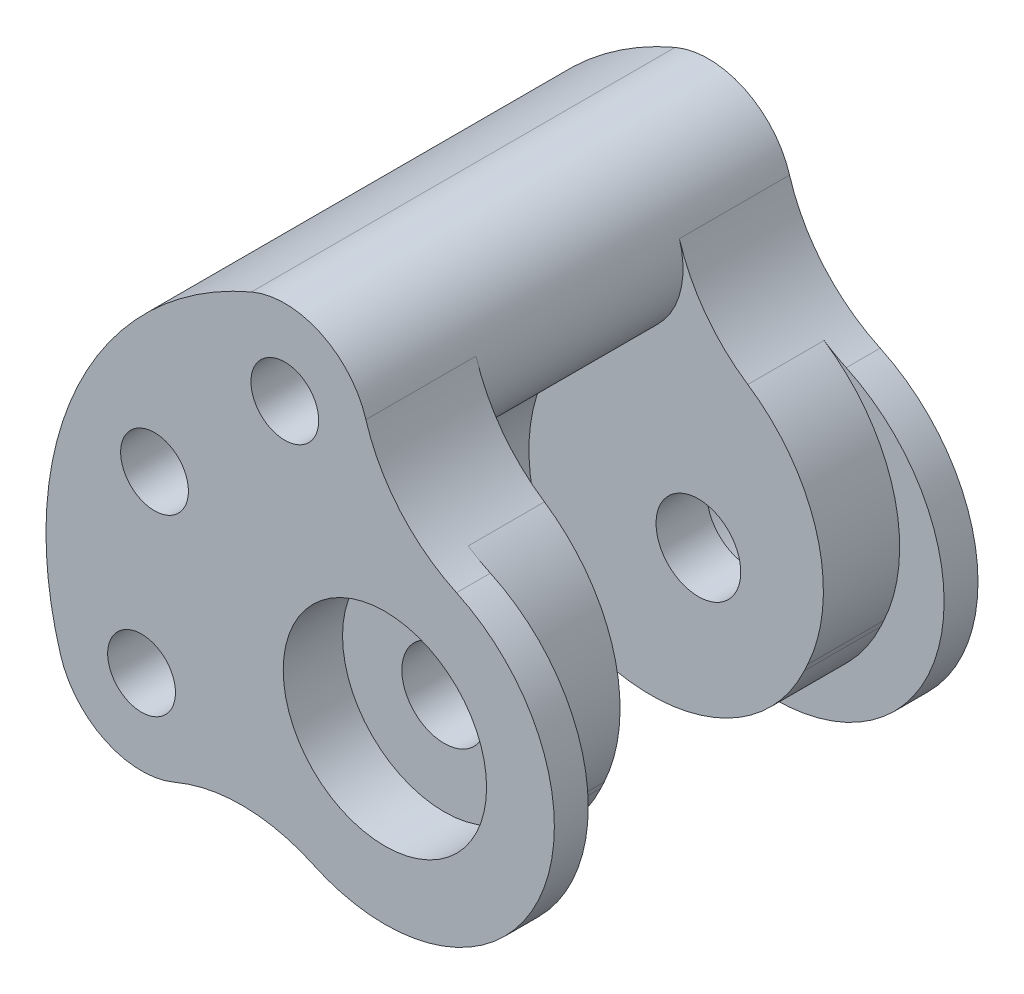
ISO-10303-21;
HEADER;
FILE_DESCRIPTION(('STEP AP214'),'2;1');
FILE_NAME('part.step','',(''),(''),'','','');
FILE_SCHEMA(('AUTOMOTIVE_DESIGN { 1 0 10303 214 1 1 1 1 }'));
ENDSEC;
DATA;
#1=APPLICATION_CONTEXT('core data for automotive mechanical design processes');
#2=APPLICATION_PROTOCOL_DEFINITION('international standard','automotive_design',2000,#1);
#3=PRODUCT_CONTEXT('',#1,'mechanical');
#4=PRODUCT('Part','Part','',(#3));
#5=PRODUCT_RELATED_PRODUCT_CATEGORY('part','',(#4));
#6=PRODUCT_DEFINITION_FORMATION('','',#4);
#7=PRODUCT_DEFINITION_CONTEXT('part definition',#1,'design');
#8=PRODUCT_DEFINITION('design','',#6,#7);
#9=PRODUCT_DEFINITION_SHAPE('','',#8);
#10=(LENGTH_UNIT() NAMED_UNIT(*) SI_UNIT(.MILLI.,.METRE.));
#11=(NAMED_UNIT(*) PLANE_ANGLE_UNIT() SI_UNIT($,.RADIAN.));
#12=(NAMED_UNIT(*) SI_UNIT($,.STERADIAN.) SOLID_ANGLE_UNIT());
#13=UNCERTAINTY_MEASURE_WITH_UNIT(LENGTH_MEASURE(1.E-05),#10,'distance_accuracy_value','');
#14=(GEOMETRIC_REPRESENTATION_CONTEXT(3) GLOBAL_UNCERTAINTY_ASSIGNED_CONTEXT((#13)) GLOBAL_UNIT_ASSIGNED_CONTEXT((#10,
#11,#12)) REPRESENTATION_CONTEXT('',''));
#15=CARTESIAN_POINT('',(0.,0.,0.));
#16=DIRECTION('',(0.,0.,1.));
#17=DIRECTION('',(1.,0.,0.));
#18=AXIS2_PLACEMENT_3D('',#15,#16,#17);
#19=CARTESIAN_POINT('',(0.,0.,25.));
#20=DIRECTION('',(0.,0.,-1.));
#21=DIRECTION('',(-1.,0.,0.));
#22=AXIS2_PLACEMENT_3D('',#19,#20,#21);
#23=CYLINDRICAL_SURFACE('',#22,2.5);
#24=CARTESIAN_POINT('',(0.,0.,18.5));
#25=DIRECTION('',(0.,0.,-1.));
#26=DIRECTION('',(-1.,0.,0.));
#27=AXIS2_PLACEMENT_3D('',#24,#25,#26);
#28=CIRCLE('',#27,2.5);
#29=CARTESIAN_POINT('',(-2.5,0.,18.5));
#30=VERTEX_POINT('',#29);
#31=EDGE_CURVE('E197',#30,#30,#28,.T.);
#32=ORIENTED_EDGE('',*,*,#31,.T.);
#33=EDGE_LOOP('',(#32));
#34=FACE_BOUND('',#33,.T.);
#35=CARTESIAN_POINT('',(0.,0.,21.5));
#36=DIRECTION('',(0.,0.,1.));
#37=DIRECTION('',(1.,0.,0.));
#38=AXIS2_PLACEMENT_3D('',#35,#36,#37);
#39=CIRCLE('',#38,2.5);
#40=CARTESIAN_POINT('',(2.5,0.,21.5));
#41=VERTEX_POINT('',#40);
#42=EDGE_CURVE('E299',#41,#41,#39,.T.);
#43=ORIENTED_EDGE('',*,*,#42,.T.);
#44=EDGE_LOOP('',(#43));
#45=FACE_BOUND('',#44,.T.);
#46=ADVANCED_FACE('F38',(#34,#45),#23,.F.);
#47=CARTESIAN_POINT('',(0.,0.,6.5));
#48=DIRECTION('',(0.,0.,-1.));
#49=DIRECTION('',(-1.,0.,0.));
#50=AXIS2_PLACEMENT_3D('',#47,#48,#49);
#51=CIRCLE('',#50,2.5);
#52=CARTESIAN_POINT('',(-2.5,0.,6.5));
#53=VERTEX_POINT('',#52);
#54=EDGE_CURVE('E205',#53,#53,#51,.T.);
#55=ORIENTED_EDGE('',*,*,#54,.F.);
#56=EDGE_LOOP('',(#55));
#57=FACE_BOUND('',#56,.T.);
#58=CARTESIAN_POINT('',(0.,0.,3.5));
#59=DIRECTION('',(0.,0.,-1.));
#60=DIRECTION('',(-1.,0.,0.));
#61=AXIS2_PLACEMENT_3D('',#58,#59,#60);
#62=CIRCLE('',#61,2.5);
#63=CARTESIAN_POINT('',(-2.5,0.,3.5));
#64=VERTEX_POINT('',#63);
#65=EDGE_CURVE('E203',#64,#64,#62,.T.);
#66=ORIENTED_EDGE('',*,*,#65,.T.);
#67=EDGE_LOOP('',(#66));
#68=FACE_BOUND('',#67,.T.);
#69=ADVANCED_FACE('F470',(#57,#68),#23,.F.);
#70=CARTESIAN_POINT('',(0.,0.,25.));
#71=DIRECTION('',(0.,0.,-1.));
#72=DIRECTION('',(-1.,0.,0.));
#73=AXIS2_PLACEMENT_3D('',#70,#71,#72);
#74=CYLINDRICAL_SURFACE('',#73,10.);
#75=DIRECTION('',(0.,0.,-1.));
#76=VECTOR('',#75,1.);
#77=CARTESIAN_POINT('',(-4.22618261740694,-9.06307787036653,25.));
#78=LINE('',#77,#76);
#79=CARTESIAN_POINT('',(-4.22618261740694,-9.06307787036653,25.));
#80=VERTEX_POINT('',#79);
#81=CARTESIAN_POINT('',(-4.22618261740694,-9.06307787036653,23.));
#82=VERTEX_POINT('',#81);
#83=EDGE_CURVE('E187',#80,#82,#78,.T.);
#84=ORIENTED_EDGE('',*,*,#83,.T.);
#85=CARTESIAN_POINT('',(0.,0.,23.));
#86=DIRECTION('',(0.,0.,-1.));
#87=DIRECTION('',(-1.,0.,0.));
#88=AXIS2_PLACEMENT_3D('',#85,#86,#87);
#89=CIRCLE('',#88,10.);
#90=CARTESIAN_POINT('',(4.22618261740694,9.06307787036653,23.));
#91=VERTEX_POINT('',#90);
#92=EDGE_CURVE('E61',#91,#82,#89,.T.);
#93=ORIENTED_EDGE('',*,*,#92,.F.);
#94=DIRECTION('',(0.,0.,-1.));
#95=VECTOR('',#94,1.);
#96=CARTESIAN_POINT('',(4.22618261740694,9.06307787036653,25.));
#97=LINE('',#96,#95);
#98=CARTESIAN_POINT('',(4.22618261740694,9.06307787036653,25.));
#99=VERTEX_POINT('',#98);
#100=EDGE_CURVE('E256',#91,#99,#97,.F.);
#101=ORIENTED_EDGE('',*,*,#100,.T.);
#102=CARTESIAN_POINT('',(0.,0.,25.));
#103=DIRECTION('',(0.,0.,1.));
#104=DIRECTION('',(1.,0.,0.));
#105=AXIS2_PLACEMENT_3D('',#102,#103,#104);
#106=CIRCLE('',#105,10.);
#107=EDGE_CURVE('E225',#80,#99,#106,.T.);
#108=ORIENTED_EDGE('',*,*,#107,.F.);
#109=EDGE_LOOP('',(#84,#93,#101,#108));
#110=FACE_BOUND('',#109,.T.);
#111=ADVANCED_FACE('F401',(#110),#74,.T.);
#112=CARTESIAN_POINT('',(-14.3590117191637,-4.33806206144158,25.));
#113=DIRECTION('',(0.,0.,-1.));
#114=DIRECTION('',(-1.,0.,0.));
#115=AXIS2_PLACEMENT_3D('',#112,#113,#114);
#116=CYLINDRICAL_SURFACE('',#115,5.);
#117=DIRECTION('',(0.,0.,-1.));
#118=VECTOR('',#117,1.);
#119=CARTESIAN_POINT('',(-9.57267447944249,-2.89204137429439,12.5));
#120=LINE('',#119,#118);
#121=CARTESIAN_POINT('',(-9.57267447944249,-2.89204137429439,18.5));
#122=VERTEX_POINT('',#121);
#123=CARTESIAN_POINT('',(-9.57267447944249,-2.89204137429439,6.5));
#124=VERTEX_POINT('',#123);
#125=EDGE_CURVE('E178',#122,#124,#120,.T.);
#126=ORIENTED_EDGE('',*,*,#125,.F.);
#127=CARTESIAN_POINT('',(-14.3590117191637,-4.33806206144158,18.5));
#128=DIRECTION('',(0.,0.,-1.));
#129=DIRECTION('',(-1.,0.,0.));
#130=AXIS2_PLACEMENT_3D('',#127,#128,#129);
#131=CIRCLE('',#130,5.);
#132=CARTESIAN_POINT('',(-12.3901295577138,-8.93409328787207,18.5));
#133=VERTEX_POINT('',#132);
#134=EDGE_CURVE('E266',#122,#133,#131,.T.);
#135=ORIENTED_EDGE('',*,*,#134,.T.);
#136=DIRECTION('',(0.,0.,-1.));
#137=VECTOR('',#136,1.);
#138=CARTESIAN_POINT('',(-12.3901295577138,-8.93409328787207,25.));
#139=LINE('',#138,#137);
#140=CARTESIAN_POINT('',(-12.3901295577138,-8.93409328787207,25.));
#141=VERTEX_POINT('',#140);
#142=EDGE_CURVE('E264',#133,#141,#139,.F.);
#143=ORIENTED_EDGE('',*,*,#142,.T.);
#144=CARTESIAN_POINT('',(-14.3590117191637,-4.33806206144158,25.));
#145=DIRECTION('',(0.,0.,1.));
#146=DIRECTION('',(1.,0.,0.));
#147=AXIS2_PLACEMENT_3D('',#144,#145,#146);
#148=CIRCLE('',#147,5.);
#149=CARTESIAN_POINT('',(-19.145348958885,-5.78408274858877,25.));
#150=VERTEX_POINT('',#149);
#151=EDGE_CURVE('E222',#150,#141,#148,.T.);
#152=ORIENTED_EDGE('',*,*,#151,.F.);
#153=DIRECTION('',(0.,0.,-1.));
#154=VECTOR('',#153,1.);
#155=CARTESIAN_POINT('',(-19.145348958885,-5.78408274858877,25.));
#156=LINE('',#155,#154);
#157=CARTESIAN_POINT('',(-19.145348958885,-5.78408274858877,0.));
#158=VERTEX_POINT('',#157);
#159=EDGE_CURVE('E232',#150,#158,#156,.T.);
#160=ORIENTED_EDGE('',*,*,#159,.T.);
#161=CARTESIAN_POINT('',(-14.3590117191637,-4.33806206144158,0.));
#162=DIRECTION('',(0.,0.,1.));
#163=DIRECTION('',(1.,0.,0.));
#164=AXIS2_PLACEMENT_3D('',#161,#162,#163);
#165=CIRCLE('',#164,5.);
#166=CARTESIAN_POINT('',(-12.3901295577138,-8.93409328787207,0.));
#167=VERTEX_POINT('',#166);
#168=EDGE_CURVE('E241',#158,#167,#165,.T.);
#169=ORIENTED_EDGE('',*,*,#168,.T.);
#170=DIRECTION('',(0.,0.,-1.));
#171=VECTOR('',#170,1.);
#172=CARTESIAN_POINT('',(-12.3901295577138,-8.93409328787207,25.));
#173=LINE('',#172,#171);
#174=CARTESIAN_POINT('',(-12.3901295577138,-8.93409328787207,6.5));
#175=VERTEX_POINT('',#174);
#176=EDGE_CURVE('E182',#167,#175,#173,.F.);
#177=ORIENTED_EDGE('',*,*,#176,.T.);
#178=CARTESIAN_POINT('',(-14.3590117191637,-4.33806206144158,6.5));
#179=DIRECTION('',(0.,0.,-1.));
#180=DIRECTION('',(-1.,0.,0.));
#181=AXIS2_PLACEMENT_3D('',#178,#179,#180);
#182=CIRCLE('',#181,5.);
#183=EDGE_CURVE('E174',#175,#124,#182,.F.);
#184=ORIENTED_EDGE('',*,*,#183,.T.);
#185=EDGE_LOOP('',(#126,#135,#143,#152,#160,#169,#177,#184));
#186=FACE_BOUND('',#185,.T.);
#187=ADVANCED_FACE('F176',(#186),#116,.T.);
#188=CARTESIAN_POINT('',(0.,0.,2.));
#189=DIRECTION('',(0.,0.,-1.));
#190=DIRECTION('',(-1.,0.,0.));
#191=AXIS2_PLACEMENT_3D('',#188,#189,#190);
#192=CIRCLE('',#191,10.);
#193=CARTESIAN_POINT('',(4.22618261740694,9.06307787036653,2.));
#194=VERTEX_POINT('',#193);
#195=CARTESIAN_POINT('',(-4.22618261740694,-9.06307787036653,2.));
#196=VERTEX_POINT('',#195);
#197=EDGE_CURVE('E53',#194,#196,#192,.T.);
#198=ORIENTED_EDGE('',*,*,#197,.T.);
#199=DIRECTION('',(0.,0.,-1.));
#200=VECTOR('',#199,1.);
#201=CARTESIAN_POINT('',(-4.22618261740694,-9.06307787036653,25.));
#202=LINE('',#201,#200);
#203=CARTESIAN_POINT('',(-4.22618261740694,-9.06307787036653,0.));
#204=VERTEX_POINT('',#203);
#205=EDGE_CURVE('E277',#196,#204,#202,.T.);
#206=ORIENTED_EDGE('',*,*,#205,.T.);
#207=CARTESIAN_POINT('',(0.,0.,0.));
#208=DIRECTION('',(0.,0.,1.));
#209=DIRECTION('',(1.,0.,0.));
#210=AXIS2_PLACEMENT_3D('',#207,#208,#209);
#211=CIRCLE('',#210,10.);
#212=CARTESIAN_POINT('',(4.22618261740694,9.06307787036653,0.));
#213=VERTEX_POINT('',#212);
#214=EDGE_CURVE('E243',#204,#213,#211,.T.);
#215=ORIENTED_EDGE('',*,*,#214,.T.);
#216=DIRECTION('',(0.,0.,-1.));
#217=VECTOR('',#216,1.);
#218=CARTESIAN_POINT('',(4.22618261740694,9.06307787036653,25.));
#219=LINE('',#218,#217);
#220=EDGE_CURVE('E279',#213,#194,#219,.F.);
#221=ORIENTED_EDGE('',*,*,#220,.T.);
#222=EDGE_LOOP('',(#198,#206,#215,#221));
#223=FACE_BOUND('',#222,.T.);
#224=ADVANCED_FACE('F466',(#223),#74,.T.);
#225=CARTESIAN_POINT('',(-5.90664648434985,13.7880936792915,25.));
#226=DIRECTION('',(0.,0.,-1.));
#227=DIRECTION('',(-1.,0.,0.));
#228=AXIS2_PLACEMENT_3D('',#225,#226,#227);
#229=CYLINDRICAL_SURFACE('',#228,5.);
#230=CARTESIAN_POINT('',(-5.90664648434985,13.7880936792915,25.));
#231=DIRECTION('',(0.,0.,1.));
#232=DIRECTION('',(1.,0.,0.));
#233=AXIS2_PLACEMENT_3D('',#230,#231,#232);
#234=CIRCLE('',#233,5.);
#235=CARTESIAN_POINT('',(-1.12030924462861,15.2341143664387,25.));
#236=VERTEX_POINT('',#235);
#237=CARTESIAN_POINT('',(-7.8755286457998,18.384124905722,25.));
#238=VERTEX_POINT('',#237);
#239=EDGE_CURVE('E228',#236,#238,#234,.T.);
#240=ORIENTED_EDGE('',*,*,#239,.F.);
#241=DIRECTION('',(0.,0.,-1.));
#242=VECTOR('',#241,1.);
#243=CARTESIAN_POINT('',(-1.12030924462861,15.2341143664387,25.));
#244=LINE('',#243,#242);
#245=CARTESIAN_POINT('',(-1.12030924462861,15.2341143664387,18.5));
#246=VERTEX_POINT('',#245);
#247=EDGE_CURVE('E274',#236,#246,#244,.T.);
#248=ORIENTED_EDGE('',*,*,#247,.T.);
#249=CARTESIAN_POINT('',(-5.90664648434985,13.7880936792915,18.5));
#250=DIRECTION('',(0.,0.,-1.));
#251=DIRECTION('',(-1.,0.,0.));
#252=AXIS2_PLACEMENT_3D('',#249,#250,#251);
#253=CIRCLE('',#252,5.);
#254=CARTESIAN_POINT('',(-3.9377643228999,9.19206245286099,18.5));
#255=VERTEX_POINT('',#254);
#256=EDGE_CURVE('E272',#246,#255,#253,.T.);
#257=ORIENTED_EDGE('',*,*,#256,.T.);
#258=DIRECTION('',(0.,0.,-1.));
#259=VECTOR('',#258,1.);
#260=CARTESIAN_POINT('',(-3.9377643228999,9.19206245286099,25.));
#261=LINE('',#260,#259);
#262=CARTESIAN_POINT('',(-3.9377643228999,9.19206245286099,6.5));
#263=VERTEX_POINT('',#262);
#264=EDGE_CURVE('E254',#255,#263,#261,.T.);
#265=ORIENTED_EDGE('',*,*,#264,.T.);
#266=CARTESIAN_POINT('',(-5.90664648434985,13.7880936792915,6.5));
#267=DIRECTION('',(0.,0.,-1.));
#268=DIRECTION('',(-1.,0.,0.));
#269=AXIS2_PLACEMENT_3D('',#266,#267,#268);
#270=CIRCLE('',#269,5.);
#271=CARTESIAN_POINT('',(-1.12030924462861,15.2341143664387,6.5));
#272=VERTEX_POINT('',#271);
#273=EDGE_CURVE('E201',#263,#272,#270,.F.);
#274=ORIENTED_EDGE('',*,*,#273,.T.);
#275=DIRECTION('',(0.,0.,-1.));
#276=VECTOR('',#275,1.);
#277=CARTESIAN_POINT('',(-1.12030924462861,15.2341143664387,25.));
#278=LINE('',#277,#276);
#279=CARTESIAN_POINT('',(-1.12030924462861,15.2341143664387,0.));
#280=VERTEX_POINT('',#279);
#281=EDGE_CURVE('E269',#272,#280,#278,.T.);
#282=ORIENTED_EDGE('',*,*,#281,.T.);
#283=CARTESIAN_POINT('',(-5.90664648434985,13.7880936792915,0.));
#284=DIRECTION('',(0.,0.,1.));
#285=DIRECTION('',(1.,0.,0.));
#286=AXIS2_PLACEMENT_3D('',#283,#284,#285);
#287=CIRCLE('',#286,5.);
#288=CARTESIAN_POINT('',(-7.8755286457998,18.384124905722,0.));
#289=VERTEX_POINT('',#288);
#290=EDGE_CURVE('E246',#280,#289,#287,.T.);
#291=ORIENTED_EDGE('',*,*,#290,.T.);
#292=DIRECTION('',(0.,0.,-1.));
#293=VECTOR('',#292,1.);
#294=CARTESIAN_POINT('',(-7.8755286457998,18.384124905722,25.));
#295=LINE('',#294,#293);
#296=EDGE_CURVE('E251',#238,#289,#295,.T.);
#297=ORIENTED_EDGE('',*,*,#296,.F.);
#298=EDGE_LOOP('',(#240,#248,#257,#265,#274,#282,#291,#297));
#299=FACE_BOUND('',#298,.T.);
#300=ADVANCED_FACE('F380',(#299),#229,.T.);
#301=CARTESIAN_POINT('',(-13.5946168055498,6.3392739261104,25.));
#302=DIRECTION('',(0.,0.,-1.));
#303=DIRECTION('',(-1.,0.,0.));
#304=AXIS2_PLACEMENT_3D('',#301,#302,#303);
#305=CYLINDRICAL_SURFACE('',#304,2.);
#306=CARTESIAN_POINT('',(-13.5946168055498,6.3392739261104,25.));
#307=DIRECTION('',(0.,0.,1.));
#308=DIRECTION('',(1.,0.,0.));
#309=AXIS2_PLACEMENT_3D('',#306,#307,#308);
#310=CIRCLE('',#309,2.);
#311=CARTESIAN_POINT('',(-11.5946168055498,6.3392739261104,25.));
#312=VERTEX_POINT('',#311);
#313=EDGE_CURVE('E219',#312,#312,#310,.T.);
#314=ORIENTED_EDGE('',*,*,#313,.T.);
#315=EDGE_LOOP('',(#314));
#316=FACE_BOUND('',#315,.T.);
#317=CARTESIAN_POINT('',(-13.5946168055498,6.3392739261104,0.));
#318=DIRECTION('',(0.,0.,1.));
#319=DIRECTION('',(1.,0.,0.));
#320=AXIS2_PLACEMENT_3D('',#317,#318,#319);
#321=CIRCLE('',#320,2.);
#322=CARTESIAN_POINT('',(-11.5946168055498,6.3392739261104,0.));
#323=VERTEX_POINT('',#322);
#324=EDGE_CURVE('E238',#323,#323,#321,.T.);
#325=ORIENTED_EDGE('',*,*,#324,.F.);
#326=EDGE_LOOP('',(#325));
#327=FACE_BOUND('',#326,.T.);
#328=ADVANCED_FACE('F454',(#316,#327),#305,.F.);
#329=CARTESIAN_POINT('',(-5.90664648434985,13.7880936792915,25.));
#330=DIRECTION('',(0.,0.,-1.));
#331=DIRECTION('',(-1.,0.,0.));
#332=AXIS2_PLACEMENT_3D('',#329,#330,#331);
#333=CYLINDRICAL_SURFACE('',#332,2.);
#334=CARTESIAN_POINT('',(-5.90664648434985,13.7880936792915,25.));
#335=DIRECTION('',(0.,0.,1.));
#336=DIRECTION('',(1.,0.,0.));
#337=AXIS2_PLACEMENT_3D('',#334,#335,#336);
#338=CIRCLE('',#337,2.);
#339=CARTESIAN_POINT('',(-3.90664648434985,13.7880936792915,25.));
#340=VERTEX_POINT('',#339);
#341=EDGE_CURVE('E215',#340,#340,#338,.T.);
#342=ORIENTED_EDGE('',*,*,#341,.T.);
#343=EDGE_LOOP('',(#342));
#344=FACE_BOUND('',#343,.T.);
#345=CARTESIAN_POINT('',(-5.90664648434985,13.7880936792915,0.));
#346=DIRECTION('',(0.,0.,1.));
#347=DIRECTION('',(1.,0.,0.));
#348=AXIS2_PLACEMENT_3D('',#345,#346,#347);
#349=CIRCLE('',#348,2.);
#350=CARTESIAN_POINT('',(-3.90664648434985,13.7880936792915,0.));
#351=VERTEX_POINT('',#350);
#352=EDGE_CURVE('E235',#351,#351,#349,.T.);
#353=ORIENTED_EDGE('',*,*,#352,.F.);
#354=EDGE_LOOP('',(#353));
#355=FACE_BOUND('',#354,.T.);
#356=ADVANCED_FACE('F456',(#344,#355),#333,.F.);
#357=CARTESIAN_POINT('',(-14.3590117191637,-4.33806206144158,25.));
#358=DIRECTION('',(0.,0.,-1.));
#359=DIRECTION('',(-1.,0.,0.));
#360=AXIS2_PLACEMENT_3D('',#357,#358,#359);
#361=CYLINDRICAL_SURFACE('',#360,2.);
#362=CARTESIAN_POINT('',(-14.3590117191637,-4.33806206144158,25.));
#363=DIRECTION('',(0.,0.,1.));
#364=DIRECTION('',(1.,0.,0.));
#365=AXIS2_PLACEMENT_3D('',#362,#363,#364);
#366=CIRCLE('',#365,2.);
#367=CARTESIAN_POINT('',(-12.3590117191637,-4.33806206144158,25.));
#368=VERTEX_POINT('',#367);
#369=EDGE_CURVE('E212',#368,#368,#366,.T.);
#370=ORIENTED_EDGE('',*,*,#369,.T.);
#371=EDGE_LOOP('',(#370));
#372=FACE_BOUND('',#371,.T.);
#373=CARTESIAN_POINT('',(-14.3590117191637,-4.33806206144158,0.));
#374=DIRECTION('',(0.,0.,1.));
#375=DIRECTION('',(1.,0.,0.));
#376=AXIS2_PLACEMENT_3D('',#373,#374,#375);
#377=CIRCLE('',#376,2.);
#378=CARTESIAN_POINT('',(-12.3590117191637,-4.33806206144158,0.));
#379=VERTEX_POINT('',#378);
#380=EDGE_CURVE('E196',#379,#379,#377,.T.);
#381=ORIENTED_EDGE('',*,*,#380,.F.);
#382=EDGE_LOOP('',(#381));
#383=FACE_BOUND('',#382,.T.);
#384=ADVANCED_FACE('F463',(#372,#383),#361,.F.);
#385=CARTESIAN_POINT('',(0.,0.,25.));
#386=DIRECTION('',(0.,0.,-1.));
#387=DIRECTION('',(-1.,0.,0.));
#388=AXIS2_PLACEMENT_3D('',#385,#386,#387);
#389=CYLINDRICAL_SURFACE('',#388,20.);
#390=CARTESIAN_POINT('',(0.,0.,0.));
#391=DIRECTION('',(0.,0.,1.));
#392=DIRECTION('',(1.,0.,0.));
#393=AXIS2_PLACEMENT_3D('',#390,#391,#392);
#394=CIRCLE('',#393,20.);
#395=EDGE_CURVE('E216',#289,#158,#394,.T.);
#396=ORIENTED_EDGE('',*,*,#395,.T.);
#397=ORIENTED_EDGE('',*,*,#159,.F.);
#398=CARTESIAN_POINT('',(0.,0.,25.));
#399=DIRECTION('',(0.,0.,1.));
#400=DIRECTION('',(1.,0.,0.));
#401=AXIS2_PLACEMENT_3D('',#398,#399,#400);
#402=CIRCLE('',#401,20.);
#403=EDGE_CURVE('E230',#238,#150,#402,.T.);
#404=ORIENTED_EDGE('',*,*,#403,.F.);
#405=ORIENTED_EDGE('',*,*,#296,.T.);
#406=EDGE_LOOP('',(#396,#397,#404,#405));
#407=FACE_BOUND('',#406,.T.);
#408=ADVANCED_FACE('F389',(#407),#389,.T.);
#409=CARTESIAN_POINT('',(0.,0.,25.));
#410=DIRECTION('',(0.,0.,1.));
#411=DIRECTION('',(1.,0.,0.));
#412=AXIS2_PLACEMENT_3D('',#409,#410,#411);
#413=PLANE('',#412);
#414=CARTESIAN_POINT('',(0.,0.,25.));
#415=DIRECTION('',(0.,0.,1.));
#416=DIRECTION('',(1.,0.,0.));
#417=AXIS2_PLACEMENT_3D('',#414,#415,#416);
#418=CIRCLE('',#417,6.);
#419=CARTESIAN_POINT('',(6.,0.,25.));
#420=VERTEX_POINT('',#419);
#421=EDGE_CURVE('E429',#420,#420,#418,.T.);
#422=ORIENTED_EDGE('',*,*,#421,.F.);
#423=EDGE_LOOP('',(#422));
#424=FACE_BOUND('',#423,.T.);
#425=ORIENTED_EDGE('',*,*,#369,.F.);
#426=EDGE_LOOP('',(#425));
#427=FACE_BOUND('',#426,.T.);
#428=ORIENTED_EDGE('',*,*,#341,.F.);
#429=EDGE_LOOP('',(#428));
#430=FACE_BOUND('',#429,.T.);
#431=ORIENTED_EDGE('',*,*,#313,.F.);
#432=EDGE_LOOP('',(#431));
#433=FACE_BOUND('',#432,.T.);
#434=ORIENTED_EDGE('',*,*,#151,.T.);
#435=CARTESIAN_POINT('',(-8.45236523481388,-18.1261557407331,25.));
#436=DIRECTION('',(0.,0.,1.));
#437=DIRECTION('',(1.,0.,0.));
#438=AXIS2_PLACEMENT_3D('',#435,#436,#437);
#439=CIRCLE('',#438,10.);
#440=EDGE_CURVE('E283',#141,#80,#439,.F.);
#441=ORIENTED_EDGE('',*,*,#440,.T.);
#442=ORIENTED_EDGE('',*,*,#107,.T.);
#443=CARTESIAN_POINT('',(8.45236523481387,18.1261557407331,25.));
#444=DIRECTION('',(0.,0.,1.));
#445=DIRECTION('',(1.,0.,0.));
#446=AXIS2_PLACEMENT_3D('',#443,#444,#445);
#447=CIRCLE('',#446,10.);
#448=EDGE_CURVE('E288',#99,#236,#447,.F.);
#449=ORIENTED_EDGE('',*,*,#448,.T.);
#450=ORIENTED_EDGE('',*,*,#239,.T.);
#451=ORIENTED_EDGE('',*,*,#403,.T.);
#452=EDGE_LOOP('',(#434,#441,#442,#449,#450,#451));
#453=FACE_BOUND('',#452,.T.);
#454=ADVANCED_FACE('F395',(#424,#427,#430,#433,#453),#413,.T.);
#455=CARTESIAN_POINT('',(0.,0.,0.));
#456=DIRECTION('',(0.,0.,1.));
#457=DIRECTION('',(1.,0.,0.));
#458=AXIS2_PLACEMENT_3D('',#455,#456,#457);
#459=PLANE('',#458);
#460=CARTESIAN_POINT('',(0.,0.,0.));
#461=DIRECTION('',(0.,0.,-1.));
#462=DIRECTION('',(-1.,0.,0.));
#463=AXIS2_PLACEMENT_3D('',#460,#461,#462);
#464=CIRCLE('',#463,6.);
#465=CARTESIAN_POINT('',(-6.,0.,0.));
#466=VERTEX_POINT('',#465);
#467=EDGE_CURVE('E302',#466,#466,#464,.T.);
#468=ORIENTED_EDGE('',*,*,#467,.F.);
#469=EDGE_LOOP('',(#468));
#470=FACE_BOUND('',#469,.T.);
#471=ORIENTED_EDGE('',*,*,#380,.T.);
#472=EDGE_LOOP('',(#471));
#473=FACE_BOUND('',#472,.T.);
#474=ORIENTED_EDGE('',*,*,#352,.T.);
#475=EDGE_LOOP('',(#474));
#476=FACE_BOUND('',#475,.T.);
#477=ORIENTED_EDGE('',*,*,#324,.T.);
#478=EDGE_LOOP('',(#477));
#479=FACE_BOUND('',#478,.T.);
#480=ORIENTED_EDGE('',*,*,#168,.F.);
#481=ORIENTED_EDGE('',*,*,#395,.F.);
#482=ORIENTED_EDGE('',*,*,#290,.F.);
#483=CARTESIAN_POINT('',(8.45236523481387,18.1261557407331,0.));
#484=DIRECTION('',(0.,0.,1.));
#485=DIRECTION('',(1.,0.,0.));
#486=AXIS2_PLACEMENT_3D('',#483,#484,#485);
#487=CIRCLE('',#486,10.);
#488=EDGE_CURVE('E290',#280,#213,#487,.T.);
#489=ORIENTED_EDGE('',*,*,#488,.T.);
#490=ORIENTED_EDGE('',*,*,#214,.F.);
#491=CARTESIAN_POINT('',(-8.45236523481388,-18.1261557407331,0.));
#492=DIRECTION('',(0.,0.,1.));
#493=DIRECTION('',(1.,0.,0.));
#494=AXIS2_PLACEMENT_3D('',#491,#492,#493);
#495=CIRCLE('',#494,10.);
#496=EDGE_CURVE('E294',#204,#167,#495,.T.);
#497=ORIENTED_EDGE('',*,*,#496,.T.);
#498=EDGE_LOOP('',(#480,#481,#482,#489,#490,#497));
#499=FACE_BOUND('',#498,.T.);
#500=ADVANCED_FACE('F385',(#470,#473,#476,#479,#499),#459,.F.);
#501=CARTESIAN_POINT('',(0.,0.,18.5));
#502=DIRECTION('',(0.,0.,-1.));
#503=DIRECTION('',(-1.,0.,0.));
#504=AXIS2_PLACEMENT_3D('',#501,#502,#503);
#505=CYLINDRICAL_SURFACE('',#504,10.);
#506=ORIENTED_EDGE('',*,*,#125,.T.);
#507=CARTESIAN_POINT('',(0.,0.,6.5));
#508=DIRECTION('',(0.,0.,-1.));
#509=DIRECTION('',(-1.,0.,0.));
#510=AXIS2_PLACEMENT_3D('',#507,#508,#509);
#511=CIRCLE('',#510,10.);
#512=EDGE_CURVE('E193',#124,#263,#511,.T.);
#513=ORIENTED_EDGE('',*,*,#512,.T.);
#514=ORIENTED_EDGE('',*,*,#264,.F.);
#515=CARTESIAN_POINT('',(0.,0.,18.5));
#516=DIRECTION('',(0.,0.,-1.));
#517=DIRECTION('',(-1.,0.,0.));
#518=AXIS2_PLACEMENT_3D('',#515,#516,#517);
#519=CIRCLE('',#518,10.);
#520=EDGE_CURVE('E195',#122,#255,#519,.T.);
#521=ORIENTED_EDGE('',*,*,#520,.F.);
#522=EDGE_LOOP('',(#506,#513,#514,#521));
#523=FACE_BOUND('',#522,.T.);
#524=ADVANCED_FACE('F191',(#523),#505,.F.);
#525=CARTESIAN_POINT('',(0.,0.,18.5));
#526=DIRECTION('',(0.,0.,-1.));
#527=DIRECTION('',(-1.,0.,0.));
#528=AXIS2_PLACEMENT_3D('',#525,#526,#527);
#529=PLANE('',#528);
#530=DIRECTION('',(0.422618261740694,0.906307787036653,0.));
#531=VECTOR('',#530,1.);
#532=CARTESIAN_POINT('',(6.34415450925657,-2.95832783218486,18.5));
#533=LINE('',#532,#531);
#534=CARTESIAN_POINT('',(6.24852442079498,-3.16340721869967,18.5));
#535=VERTEX_POINT('',#534);
#536=CARTESIAN_POINT('',(6.43978459771815,-2.75324844567005,18.5));
#537=VERTEX_POINT('',#536);
#538=EDGE_CURVE('E427',#535,#537,#533,.T.);
#539=ORIENTED_EDGE('',*,*,#538,.F.);
#540=CARTESIAN_POINT('',(-2.81455344957154,1.06277539870727,18.5));
#541=DIRECTION('',(0.,0.,-1.));
#542=DIRECTION('',(-1.,0.,0.));
#543=AXIS2_PLACEMENT_3D('',#540,#541,#542);
#544=CIRCLE('',#543,10.);
#545=CARTESIAN_POINT('',(-5.63345934219271,-8.53169017101289,18.5));
#546=VERTEX_POINT('',#545);
#547=EDGE_CURVE('E313',#535,#546,#544,.T.);
#548=ORIENTED_EDGE('',*,*,#547,.T.);
#549=CARTESIAN_POINT('',(-8.45236523481388,-18.1261557407331,18.5));
#550=DIRECTION('',(0.,0.,-1.));
#551=DIRECTION('',(-1.,0.,0.));
#552=AXIS2_PLACEMENT_3D('',#549,#550,#551);
#553=CIRCLE('',#552,10.);
#554=EDGE_CURVE('E281',#546,#133,#553,.F.);
#555=ORIENTED_EDGE('',*,*,#554,.T.);
#556=ORIENTED_EDGE('',*,*,#134,.F.);
#557=ORIENTED_EDGE('',*,*,#520,.T.);
#558=ORIENTED_EDGE('',*,*,#256,.F.);
#559=CARTESIAN_POINT('',(8.45236523481387,18.1261557407331,18.5));
#560=DIRECTION('',(0.,0.,-1.));
#561=DIRECTION('',(-1.,0.,0.));
#562=AXIS2_PLACEMENT_3D('',#559,#560,#561);
#563=CIRCLE('',#562,10.);
#564=CARTESIAN_POINT('',(2.91453598108275,9.79954495623497,18.5));
#565=VERTEX_POINT('',#564);
#566=EDGE_CURVE('E285',#246,#565,#563,.F.);
#567=ORIENTED_EDGE('',*,*,#566,.T.);
#568=CARTESIAN_POINT('',(-2.62329327264838,1.47293417173689,18.5));
#569=DIRECTION('',(0.,0.,-1.));
#570=DIRECTION('',(-1.,0.,0.));
#571=AXIS2_PLACEMENT_3D('',#568,#569,#570);
#572=CIRCLE('',#571,10.);
#573=EDGE_CURVE('E311',#565,#537,#572,.T.);
#574=ORIENTED_EDGE('',*,*,#573,.T.);
#575=EDGE_LOOP('',(#539,#548,#555,#556,#557,#558,#567,#574));
#576=FACE_BOUND('',#575,.T.);
#577=ORIENTED_EDGE('',*,*,#31,.F.);
#578=EDGE_LOOP('',(#577));
#579=FACE_BOUND('',#578,.T.);
#580=ADVANCED_FACE('F410',(#576,#579),#529,.T.);
#581=CARTESIAN_POINT('',(0.,0.,6.5));
#582=DIRECTION('',(0.,0.,-1.));
#583=DIRECTION('',(-1.,0.,0.));
#584=AXIS2_PLACEMENT_3D('',#581,#582,#583);
#585=PLANE('',#584);
#586=ORIENTED_EDGE('',*,*,#54,.T.);
#587=EDGE_LOOP('',(#586));
#588=FACE_BOUND('',#587,.T.);
#589=CARTESIAN_POINT('',(-8.45236523481388,-18.1261557407331,6.5));
#590=DIRECTION('',(0.,0.,-1.));
#591=DIRECTION('',(-1.,0.,0.));
#592=AXIS2_PLACEMENT_3D('',#589,#590,#591);
#593=CIRCLE('',#592,10.);
#594=CARTESIAN_POINT('',(-5.63345934219271,-8.53169017101289,6.5));
#595=VERTEX_POINT('',#594);
#596=EDGE_CURVE('E296',#175,#595,#593,.T.);
#597=ORIENTED_EDGE('',*,*,#596,.T.);
#598=CARTESIAN_POINT('',(-2.81455344957154,1.06277539870727,6.5));
#599=DIRECTION('',(0.,0.,-1.));
#600=DIRECTION('',(-1.,0.,0.));
#601=AXIS2_PLACEMENT_3D('',#598,#599,#600);
#602=CIRCLE('',#601,10.);
#603=CARTESIAN_POINT('',(6.24852442079498,-3.16340721869967,6.5));
#604=VERTEX_POINT('',#603);
#605=EDGE_CURVE('E339',#595,#604,#602,.F.);
#606=ORIENTED_EDGE('',*,*,#605,.T.);
#607=DIRECTION('',(0.422618261740694,0.906307787036653,0.));
#608=VECTOR('',#607,1.);
#609=CARTESIAN_POINT('',(6.34415450925657,-2.95832783218486,6.5));
#610=LINE('',#609,#608);
#611=CARTESIAN_POINT('',(6.43978459771825,-2.75324844566984,6.5));
#612=VERTEX_POINT('',#611);
#613=EDGE_CURVE('E297',#604,#612,#610,.T.);
#614=ORIENTED_EDGE('',*,*,#613,.T.);
#615=CARTESIAN_POINT('',(-2.62329327264838,1.47293417173689,6.5));
#616=DIRECTION('',(0.,0.,-1.));
#617=DIRECTION('',(-1.,0.,0.));
#618=AXIS2_PLACEMENT_3D('',#615,#616,#617);
#619=CIRCLE('',#618,10.);
#620=CARTESIAN_POINT('',(2.91453598108275,9.79954495623497,6.5));
#621=VERTEX_POINT('',#620);
#622=EDGE_CURVE('E337',#612,#621,#619,.F.);
#623=ORIENTED_EDGE('',*,*,#622,.T.);
#624=CARTESIAN_POINT('',(8.45236523481387,18.1261557407331,6.5));
#625=DIRECTION('',(0.,0.,-1.));
#626=DIRECTION('',(-1.,0.,0.));
#627=AXIS2_PLACEMENT_3D('',#624,#625,#626);
#628=CIRCLE('',#627,10.);
#629=EDGE_CURVE('E292',#621,#272,#628,.T.);
#630=ORIENTED_EDGE('',*,*,#629,.T.);
#631=ORIENTED_EDGE('',*,*,#273,.F.);
#632=ORIENTED_EDGE('',*,*,#512,.F.);
#633=ORIENTED_EDGE('',*,*,#183,.F.);
#634=EDGE_LOOP('',(#597,#606,#614,#623,#630,#631,#632,#633));
#635=FACE_BOUND('',#634,.T.);
#636=ADVANCED_FACE('F199',(#588,#635),#585,.F.);
#637=CARTESIAN_POINT('',(-8.45236523481388,-18.1261557407331,25.));
#638=DIRECTION('',(0.,0.,1.));
#639=DIRECTION('',(1.,0.,0.));
#640=AXIS2_PLACEMENT_3D('',#637,#638,#639);
#641=CYLINDRICAL_SURFACE('',#640,10.);
#642=ORIENTED_EDGE('',*,*,#554,.F.);
#643=DIRECTION('',(0.,0.,1.));
#644=VECTOR('',#643,1.);
#645=CARTESIAN_POINT('',(-5.63345934219271,-8.53169017101289,25.));
#646=LINE('',#645,#644);
#647=CARTESIAN_POINT('',(-5.63345934219271,-8.53169017101289,23.));
#648=VERTEX_POINT('',#647);
#649=EDGE_CURVE('E318',#546,#648,#646,.T.);
#650=ORIENTED_EDGE('',*,*,#649,.T.);
#651=CARTESIAN_POINT('',(-8.45236523481388,-18.1261557407331,23.));
#652=DIRECTION('',(0.,0.,-1.));
#653=DIRECTION('',(-1.,0.,0.));
#654=AXIS2_PLACEMENT_3D('',#651,#652,#653);
#655=CIRCLE('',#654,10.);
#656=EDGE_CURVE('E315',#648,#82,#655,.T.);
#657=ORIENTED_EDGE('',*,*,#656,.T.);
#658=ORIENTED_EDGE('',*,*,#83,.F.);
#659=ORIENTED_EDGE('',*,*,#440,.F.);
#660=ORIENTED_EDGE('',*,*,#142,.F.);
#661=EDGE_LOOP('',(#642,#650,#657,#658,#659,#660));
#662=FACE_BOUND('',#661,.T.);
#663=ADVANCED_FACE('F400',(#662),#641,.F.);
#664=CARTESIAN_POINT('',(8.45236523481387,18.1261557407331,25.));
#665=DIRECTION('',(0.,0.,1.));
#666=DIRECTION('',(1.,0.,0.));
#667=AXIS2_PLACEMENT_3D('',#664,#665,#666);
#668=CYLINDRICAL_SURFACE('',#667,10.);
#669=CARTESIAN_POINT('',(8.45236523481387,18.1261557407331,23.));
#670=DIRECTION('',(0.,0.,-1.));
#671=DIRECTION('',(-1.,0.,0.));
#672=AXIS2_PLACEMENT_3D('',#669,#670,#671);
#673=CIRCLE('',#672,10.);
#674=CARTESIAN_POINT('',(2.91453598108275,9.79954495623497,23.));
#675=VERTEX_POINT('',#674);
#676=EDGE_CURVE('E321',#91,#675,#673,.T.);
#677=ORIENTED_EDGE('',*,*,#676,.T.);
#678=DIRECTION('',(0.,0.,1.));
#679=VECTOR('',#678,1.);
#680=CARTESIAN_POINT('',(2.91453598108275,9.79954495623497,25.));
#681=LINE('',#680,#679);
#682=EDGE_CURVE('E324',#675,#565,#681,.F.);
#683=ORIENTED_EDGE('',*,*,#682,.T.);
#684=ORIENTED_EDGE('',*,*,#566,.F.);
#685=ORIENTED_EDGE('',*,*,#247,.F.);
#686=ORIENTED_EDGE('',*,*,#448,.F.);
#687=ORIENTED_EDGE('',*,*,#100,.F.);
#688=EDGE_LOOP('',(#677,#683,#684,#685,#686,#687));
#689=FACE_BOUND('',#688,.T.);
#690=ADVANCED_FACE('F406',(#689),#668,.F.);
#691=CARTESIAN_POINT('',(8.45236523481387,18.1261557407331,25.));
#692=DIRECTION('',(0.,0.,1.));
#693=DIRECTION('',(1.,0.,0.));
#694=AXIS2_PLACEMENT_3D('',#691,#692,#693);
#695=CYLINDRICAL_SURFACE('',#694,10.);
#696=ORIENTED_EDGE('',*,*,#629,.F.);
#697=DIRECTION('',(0.,0.,1.));
#698=VECTOR('',#697,1.);
#699=CARTESIAN_POINT('',(2.91453598108275,9.79954495623497,25.));
#700=LINE('',#699,#698);
#701=CARTESIAN_POINT('',(2.91453598108275,9.79954495623497,2.));
#702=VERTEX_POINT('',#701);
#703=EDGE_CURVE('E344',#621,#702,#700,.F.);
#704=ORIENTED_EDGE('',*,*,#703,.T.);
#705=CARTESIAN_POINT('',(8.45236523481387,18.1261557407331,2.));
#706=DIRECTION('',(0.,0.,-1.));
#707=DIRECTION('',(-1.,0.,0.));
#708=AXIS2_PLACEMENT_3D('',#705,#706,#707);
#709=CIRCLE('',#708,10.);
#710=EDGE_CURVE('E341',#702,#194,#709,.F.);
#711=ORIENTED_EDGE('',*,*,#710,.T.);
#712=ORIENTED_EDGE('',*,*,#220,.F.);
#713=ORIENTED_EDGE('',*,*,#488,.F.);
#714=ORIENTED_EDGE('',*,*,#281,.F.);
#715=EDGE_LOOP('',(#696,#704,#711,#712,#713,#714));
#716=FACE_BOUND('',#715,.T.);
#717=ADVANCED_FACE('F375',(#716),#695,.F.);
#718=CARTESIAN_POINT('',(-8.45236523481388,-18.1261557407331,25.));
#719=DIRECTION('',(0.,0.,1.));
#720=DIRECTION('',(1.,0.,0.));
#721=AXIS2_PLACEMENT_3D('',#718,#719,#720);
#722=CYLINDRICAL_SURFACE('',#721,10.);
#723=ORIENTED_EDGE('',*,*,#205,.F.);
#724=CARTESIAN_POINT('',(-8.45236523481388,-18.1261557407331,2.));
#725=DIRECTION('',(0.,0.,-1.));
#726=DIRECTION('',(-1.,0.,0.));
#727=AXIS2_PLACEMENT_3D('',#724,#725,#726);
#728=CIRCLE('',#727,10.);
#729=CARTESIAN_POINT('',(-5.63345934219271,-8.5316901710129,2.));
#730=VERTEX_POINT('',#729);
#731=EDGE_CURVE('E334',#196,#730,#728,.F.);
#732=ORIENTED_EDGE('',*,*,#731,.T.);
#733=DIRECTION('',(0.,0.,1.));
#734=VECTOR('',#733,1.);
#735=CARTESIAN_POINT('',(-5.63345934219271,-8.53169017101289,25.));
#736=LINE('',#735,#734);
#737=EDGE_CURVE('E332',#730,#595,#736,.T.);
#738=ORIENTED_EDGE('',*,*,#737,.T.);
#739=ORIENTED_EDGE('',*,*,#596,.F.);
#740=ORIENTED_EDGE('',*,*,#176,.F.);
#741=ORIENTED_EDGE('',*,*,#496,.F.);
#742=EDGE_LOOP('',(#723,#732,#738,#739,#740,#741));
#743=FACE_BOUND('',#742,.T.);
#744=ADVANCED_FACE('F360',(#743),#722,.F.);
#745=CARTESIAN_POINT('',(0.,0.,3.5));
#746=DIRECTION('',(0.,0.,-1.));
#747=DIRECTION('',(-1.,0.,0.));
#748=AXIS2_PLACEMENT_3D('',#745,#746,#747);
#749=CYLINDRICAL_SURFACE('',#748,6.);
#750=CARTESIAN_POINT('',(0.,0.,3.5));
#751=DIRECTION('',(0.,0.,-1.));
#752=DIRECTION('',(-1.,0.,0.));
#753=AXIS2_PLACEMENT_3D('',#750,#751,#752);
#754=CIRCLE('',#753,6.);
#755=CARTESIAN_POINT('',(-6.,0.,3.5));
#756=VERTEX_POINT('',#755);
#757=EDGE_CURVE('E208',#756,#756,#754,.T.);
#758=ORIENTED_EDGE('',*,*,#757,.F.);
#759=EDGE_LOOP('',(#758));
#760=FACE_BOUND('',#759,.T.);
#761=ORIENTED_EDGE('',*,*,#467,.T.);
#762=EDGE_LOOP('',(#761));
#763=FACE_BOUND('',#762,.T.);
#764=ADVANCED_FACE('F443',(#760,#763),#749,.F.);
#765=CARTESIAN_POINT('',(0.,0.,3.5));
#766=DIRECTION('',(0.,0.,-1.));
#767=DIRECTION('',(-1.,0.,0.));
#768=AXIS2_PLACEMENT_3D('',#765,#766,#767);
#769=PLANE('',#768);
#770=ORIENTED_EDGE('',*,*,#65,.F.);
#771=EDGE_LOOP('',(#770));
#772=FACE_BOUND('',#771,.T.);
#773=ORIENTED_EDGE('',*,*,#757,.T.);
#774=EDGE_LOOP('',(#773));
#775=FACE_BOUND('',#774,.T.);
#776=ADVANCED_FACE('F496',(#772,#775),#769,.T.);
#777=CARTESIAN_POINT('',(0.,0.,21.5));
#778=DIRECTION('',(0.,0.,1.));
#779=DIRECTION('',(1.,0.,0.));
#780=AXIS2_PLACEMENT_3D('',#777,#778,#779);
#781=CYLINDRICAL_SURFACE('',#780,6.);
#782=CARTESIAN_POINT('',(0.,0.,21.5));
#783=DIRECTION('',(0.,0.,1.));
#784=DIRECTION('',(1.,0.,0.));
#785=AXIS2_PLACEMENT_3D('',#782,#783,#784);
#786=CIRCLE('',#785,6.);
#787=CARTESIAN_POINT('',(6.,0.,21.5));
#788=VERTEX_POINT('',#787);
#789=EDGE_CURVE('E303',#788,#788,#786,.T.);
#790=ORIENTED_EDGE('',*,*,#789,.F.);
#791=EDGE_LOOP('',(#790));
#792=FACE_BOUND('',#791,.T.);
#793=ORIENTED_EDGE('',*,*,#421,.T.);
#794=EDGE_LOOP('',(#793));
#795=FACE_BOUND('',#794,.T.);
#796=ADVANCED_FACE('F500',(#792,#795),#781,.F.);
#797=CARTESIAN_POINT('',(0.,0.,21.5));
#798=DIRECTION('',(0.,0.,1.));
#799=DIRECTION('',(1.,0.,0.));
#800=AXIS2_PLACEMENT_3D('',#797,#798,#799);
#801=PLANE('',#800);
#802=ORIENTED_EDGE('',*,*,#42,.F.);
#803=EDGE_LOOP('',(#802));
#804=FACE_BOUND('',#803,.T.);
#805=ORIENTED_EDGE('',*,*,#789,.T.);
#806=EDGE_LOOP('',(#805));
#807=FACE_BOUND('',#806,.T.);
#808=ADVANCED_FACE('F504',(#804,#807),#801,.T.);
#809=CARTESIAN_POINT('',(9.36225257807293,3.51400436316846,23.));
#810=DIRECTION('',(-0.906307787036653,0.422618261740694,0.));
#811=DIRECTION('',(-0.422618261740694,-0.906307787036653,0.));
#812=AXIS2_PLACEMENT_3D('',#809,#810,#811);
#813=PLANE('',#812);
#814=ORIENTED_EDGE('',*,*,#613,.F.);
#815=DIRECTION('',(0.,0.,1.));
#816=VECTOR('',#815,1.);
#817=CARTESIAN_POINT('',(6.24852442079498,-3.16340721869967,23.));
#818=LINE('',#817,#816);
#819=CARTESIAN_POINT('',(6.24852442079499,-3.16340721869967,2.));
#820=VERTEX_POINT('',#819);
#821=EDGE_CURVE('E329',#604,#820,#818,.F.);
#822=ORIENTED_EDGE('',*,*,#821,.T.);
#823=DIRECTION('',(0.422618261740694,0.906307787036653,0.));
#824=VECTOR('',#823,1.);
#825=CARTESIAN_POINT('',(9.36225257807293,3.51400436316846,2.));
#826=LINE('',#825,#824);
#827=CARTESIAN_POINT('',(6.43978459771815,-2.75324844567005,2.));
#828=VERTEX_POINT('',#827);
#829=EDGE_CURVE('E355',#820,#828,#826,.T.);
#830=ORIENTED_EDGE('',*,*,#829,.T.);
#831=DIRECTION('',(0.,0.,1.));
#832=VECTOR('',#831,1.);
#833=CARTESIAN_POINT('',(6.43978459771815,-2.75324844567005,23.));
#834=LINE('',#833,#832);
#835=EDGE_CURVE('E327',#828,#612,#834,.T.);
#836=ORIENTED_EDGE('',*,*,#835,.T.);
#837=EDGE_LOOP('',(#814,#822,#830,#836));
#838=FACE_BOUND('',#837,.T.);
#839=ADVANCED_FACE('F367',(#838),#813,.F.);
#840=CARTESIAN_POINT('',(0.,0.,2.));
#841=DIRECTION('',(0.,0.,-1.));
#842=DIRECTION('',(-1.,0.,0.));
#843=AXIS2_PLACEMENT_3D('',#840,#841,#842);
#844=PLANE('',#843);
#845=ORIENTED_EDGE('',*,*,#197,.F.);
#846=ORIENTED_EDGE('',*,*,#710,.F.);
#847=CARTESIAN_POINT('',(-2.62329327264838,1.47293417173689,2.));
#848=DIRECTION('',(0.,0.,-1.));
#849=DIRECTION('',(-1.,0.,0.));
#850=AXIS2_PLACEMENT_3D('',#847,#848,#849);
#851=CIRCLE('',#850,10.);
#852=EDGE_CURVE('E11',#702,#828,#851,.T.);
#853=ORIENTED_EDGE('',*,*,#852,.T.);
#854=ORIENTED_EDGE('',*,*,#829,.F.);
#855=CARTESIAN_POINT('',(-2.81455344957154,1.06277539870727,2.));
#856=DIRECTION('',(0.,0.,-1.));
#857=DIRECTION('',(-1.,0.,0.));
#858=AXIS2_PLACEMENT_3D('',#855,#856,#857);
#859=CIRCLE('',#858,10.);
#860=EDGE_CURVE('E46',#820,#730,#859,.T.);
#861=ORIENTED_EDGE('',*,*,#860,.T.);
#862=ORIENTED_EDGE('',*,*,#731,.F.);
#863=EDGE_LOOP('',(#845,#846,#853,#854,#861,#862));
#864=FACE_BOUND('',#863,.T.);
#865=ADVANCED_FACE('F352',(#864),#844,.F.);
#866=DIRECTION('',(0.422618261740694,0.906307787036653,0.));
#867=VECTOR('',#866,1.);
#868=CARTESIAN_POINT('',(9.36225257807293,3.51400436316846,23.));
#869=LINE('',#868,#867);
#870=CARTESIAN_POINT('',(6.24852442079499,-3.16340721869967,23.));
#871=VERTEX_POINT('',#870);
#872=CARTESIAN_POINT('',(6.43978459771815,-2.75324844567005,23.));
#873=VERTEX_POINT('',#872);
#874=EDGE_CURVE('E421',#871,#873,#869,.T.);
#875=ORIENTED_EDGE('',*,*,#874,.F.);
#876=DIRECTION('',(0.,0.,1.));
#877=VECTOR('',#876,1.);
#878=CARTESIAN_POINT('',(6.24852442079498,-3.16340721869967,23.));
#879=LINE('',#878,#877);
#880=EDGE_CURVE('E308',#871,#535,#879,.F.);
#881=ORIENTED_EDGE('',*,*,#880,.T.);
#882=ORIENTED_EDGE('',*,*,#538,.T.);
#883=DIRECTION('',(0.,0.,1.));
#884=VECTOR('',#883,1.);
#885=CARTESIAN_POINT('',(6.43978459771815,-2.75324844567005,23.));
#886=LINE('',#885,#884);
#887=EDGE_CURVE('E306',#537,#873,#886,.T.);
#888=ORIENTED_EDGE('',*,*,#887,.T.);
#889=EDGE_LOOP('',(#875,#881,#882,#888));
#890=FACE_BOUND('',#889,.T.);
#891=ADVANCED_FACE('F424',(#890),#813,.F.);
#892=CARTESIAN_POINT('',(0.,0.,23.));
#893=DIRECTION('',(0.,0.,-1.));
#894=DIRECTION('',(-1.,0.,0.));
#895=AXIS2_PLACEMENT_3D('',#892,#893,#894);
#896=PLANE('',#895);
#897=ORIENTED_EDGE('',*,*,#92,.T.);
#898=ORIENTED_EDGE('',*,*,#656,.F.);
#899=CARTESIAN_POINT('',(-2.81455344957154,1.06277539870727,23.));
#900=DIRECTION('',(0.,0.,-1.));
#901=DIRECTION('',(-1.,0.,0.));
#902=AXIS2_PLACEMENT_3D('',#899,#900,#901);
#903=CIRCLE('',#902,10.);
#904=EDGE_CURVE('E347',#648,#871,#903,.F.);
#905=ORIENTED_EDGE('',*,*,#904,.T.);
#906=ORIENTED_EDGE('',*,*,#874,.T.);
#907=CARTESIAN_POINT('',(-2.62329327264838,1.47293417173689,23.));
#908=DIRECTION('',(0.,0.,-1.));
#909=DIRECTION('',(-1.,0.,0.));
#910=AXIS2_PLACEMENT_3D('',#907,#908,#909);
#911=CIRCLE('',#910,10.);
#912=EDGE_CURVE('E349',#873,#675,#911,.F.);
#913=ORIENTED_EDGE('',*,*,#912,.T.);
#914=ORIENTED_EDGE('',*,*,#676,.F.);
#915=EDGE_LOOP('',(#897,#898,#905,#906,#913,#914));
#916=FACE_BOUND('',#915,.T.);
#917=ADVANCED_FACE('F420',(#916),#896,.T.);
#918=CARTESIAN_POINT('',(-2.81455344957154,1.06277539870727,25.));
#919=DIRECTION('',(0.,0.,1.));
#920=DIRECTION('',(1.,0.,0.));
#921=AXIS2_PLACEMENT_3D('',#918,#919,#920);
#922=CYLINDRICAL_SURFACE('',#921,10.);
#923=ORIENTED_EDGE('',*,*,#904,.F.);
#924=ORIENTED_EDGE('',*,*,#649,.F.);
#925=ORIENTED_EDGE('',*,*,#547,.F.);
#926=ORIENTED_EDGE('',*,*,#880,.F.);
#927=EDGE_LOOP('',(#923,#924,#925,#926));
#928=FACE_BOUND('',#927,.T.);
#929=ADVANCED_FACE('F415',(#928),#922,.T.);
#930=CARTESIAN_POINT('',(-2.62329327264838,1.47293417173689,25.));
#931=DIRECTION('',(0.,0.,1.));
#932=DIRECTION('',(1.,0.,0.));
#933=AXIS2_PLACEMENT_3D('',#930,#931,#932);
#934=CYLINDRICAL_SURFACE('',#933,10.);
#935=ORIENTED_EDGE('',*,*,#912,.F.);
#936=ORIENTED_EDGE('',*,*,#887,.F.);
#937=ORIENTED_EDGE('',*,*,#573,.F.);
#938=ORIENTED_EDGE('',*,*,#682,.F.);
#939=EDGE_LOOP('',(#935,#936,#937,#938));
#940=FACE_BOUND('',#939,.T.);
#941=ADVANCED_FACE('F517',(#940),#934,.T.);
#942=CARTESIAN_POINT('',(-2.81455344957154,1.06277539870727,25.));
#943=DIRECTION('',(0.,0.,1.));
#944=DIRECTION('',(1.,0.,0.));
#945=AXIS2_PLACEMENT_3D('',#942,#943,#944);
#946=CYLINDRICAL_SURFACE('',#945,10.);
#947=ORIENTED_EDGE('',*,*,#605,.F.);
#948=ORIENTED_EDGE('',*,*,#737,.F.);
#949=ORIENTED_EDGE('',*,*,#860,.F.);
#950=ORIENTED_EDGE('',*,*,#821,.F.);
#951=EDGE_LOOP('',(#947,#948,#949,#950));
#952=FACE_BOUND('',#951,.T.);
#953=ADVANCED_FACE('F363',(#952),#946,.T.);
#954=CARTESIAN_POINT('',(-2.62329327264838,1.47293417173689,25.));
#955=DIRECTION('',(0.,0.,1.));
#956=DIRECTION('',(1.,0.,0.));
#957=AXIS2_PLACEMENT_3D('',#954,#955,#956);
#958=CYLINDRICAL_SURFACE('',#957,10.);
#959=ORIENTED_EDGE('',*,*,#622,.F.);
#960=ORIENTED_EDGE('',*,*,#835,.F.);
#961=ORIENTED_EDGE('',*,*,#852,.F.);
#962=ORIENTED_EDGE('',*,*,#703,.F.);
#963=EDGE_LOOP('',(#959,#960,#961,#962));
#964=FACE_BOUND('',#963,.T.);
#965=ADVANCED_FACE('F40',(#964),#958,.T.);
#966=CLOSED_SHELL('',(#46,#69,#111,#187,#224,#300,#328,#356,#384,#408,#454,#500,#524,#580,#636,
#663,#690,#717,#744,#764,#776,#796,#808,#839,#865,#891,#917,#929,#941,#953,#965));
#967=MANIFOLD_SOLID_BREP('B2',#966);
#968=ADVANCED_BREP_SHAPE_REPRESENTATION('',(#18,#967),#14);
#969=SHAPE_DEFINITION_REPRESENTATION(#9,#968);
ENDSEC;
END-ISO-10303-21;
